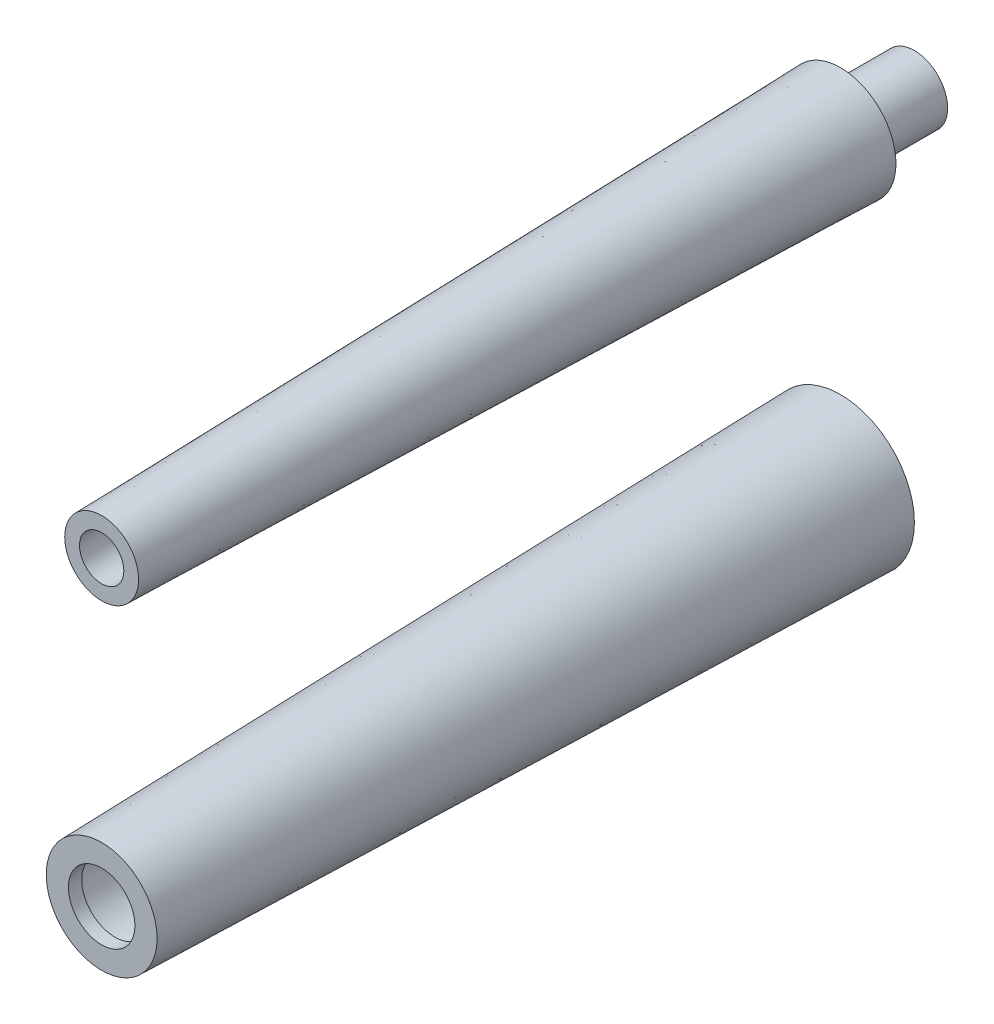
ISO-10303-21;
HEADER;
FILE_DESCRIPTION(('STEP AP214'),'2;1');
FILE_NAME('part.step','',(''),(''),'','','');
FILE_SCHEMA(('AUTOMOTIVE_DESIGN { 1 0 10303 214 1 1 1 1 }'));
ENDSEC;
DATA;
#1=APPLICATION_CONTEXT('core data for automotive mechanical design processes');
#2=APPLICATION_PROTOCOL_DEFINITION('international standard','automotive_design',2000,#1);
#3=PRODUCT_CONTEXT('',#1,'mechanical');
#4=PRODUCT('Part','Part','',(#3));
#5=PRODUCT_RELATED_PRODUCT_CATEGORY('part','',(#4));
#6=PRODUCT_DEFINITION_FORMATION('','',#4);
#7=PRODUCT_DEFINITION_CONTEXT('part definition',#1,'design');
#8=PRODUCT_DEFINITION('design','',#6,#7);
#9=PRODUCT_DEFINITION_SHAPE('','',#8);
#10=(LENGTH_UNIT() NAMED_UNIT(*) SI_UNIT(.MILLI.,.METRE.));
#11=(NAMED_UNIT(*) PLANE_ANGLE_UNIT() SI_UNIT($,.RADIAN.));
#12=(NAMED_UNIT(*) SI_UNIT($,.STERADIAN.) SOLID_ANGLE_UNIT());
#13=UNCERTAINTY_MEASURE_WITH_UNIT(LENGTH_MEASURE(1.E-05),#10,'distance_accuracy_value','');
#14=(GEOMETRIC_REPRESENTATION_CONTEXT(3) GLOBAL_UNCERTAINTY_ASSIGNED_CONTEXT((#13)) GLOBAL_UNIT_ASSIGNED_CONTEXT((#10,
#11,#12)) REPRESENTATION_CONTEXT('',''));
#15=CARTESIAN_POINT('',(0.,0.,0.));
#16=DIRECTION('',(0.,0.,1.));
#17=DIRECTION('',(1.,0.,0.));
#18=AXIS2_PLACEMENT_3D('',#15,#16,#17);
#19=CARTESIAN_POINT('',(0.,15.701730191505,0.));
#20=DIRECTION('',(0.,0.,1.));
#21=DIRECTION('',(1.,0.,0.));
#22=AXIS2_PLACEMENT_3D('',#19,#20,#21);
#23=PLANE('',#22);
#24=CARTESIAN_POINT('',(0.,15.701730191505,0.));
#25=DIRECTION('',(0.,0.,-1.));
#26=DIRECTION('',(-1.,0.,0.));
#27=AXIS2_PLACEMENT_3D('',#24,#25,#26);
#28=CIRCLE('',#27,7.5);
#29=CARTESIAN_POINT('',(-7.5,15.701730191505,0.));
#30=VERTEX_POINT('',#29);
#31=EDGE_CURVE('E47',#30,#30,#28,.T.);
#32=ORIENTED_EDGE('',*,*,#31,.T.);
#33=EDGE_LOOP('',(#32));
#34=FACE_BOUND('',#33,.T.);
#35=CARTESIAN_POINT('',(0.,15.701730191505,0.));
#36=DIRECTION('',(0.,0.,1.));
#37=DIRECTION('',(1.,0.,0.));
#38=AXIS2_PLACEMENT_3D('',#35,#36,#37);
#39=CIRCLE('',#38,4.5);
#40=CARTESIAN_POINT('',(4.5,15.701730191505,0.));
#41=VERTEX_POINT('',#40);
#42=EDGE_CURVE('E11',#41,#41,#39,.F.);
#43=ORIENTED_EDGE('',*,*,#42,.F.);
#44=EDGE_LOOP('',(#43));
#45=FACE_BOUND('',#44,.T.);
#46=ADVANCED_FACE('F41',(#34,#45),#23,.F.);
#47=CARTESIAN_POINT('',(0.,15.701730191505,0.));
#48=DIRECTION('',(0.,0.,-1.));
#49=DIRECTION('',(-1.,0.,0.));
#50=AXIS2_PLACEMENT_3D('',#47,#48,#49);
#51=CONICAL_SURFACE('',#50,7.5,0.0249947936189202);
#52=CARTESIAN_POINT('',(0.,15.701730191505,100.));
#53=DIRECTION('',(0.,0.,-1.));
#54=DIRECTION('',(-1.,0.,0.));
#55=AXIS2_PLACEMENT_3D('',#52,#53,#54);
#56=CIRCLE('',#55,5.);
#57=CARTESIAN_POINT('',(-5.,15.701730191505,100.));
#58=VERTEX_POINT('',#57);
#59=EDGE_CURVE('E51',#58,#58,#56,.T.);
#60=ORIENTED_EDGE('',*,*,#59,.T.);
#61=EDGE_LOOP('',(#60));
#62=FACE_BOUND('',#61,.T.);
#63=ORIENTED_EDGE('',*,*,#31,.F.);
#64=EDGE_LOOP('',(#63));
#65=FACE_BOUND('',#64,.T.);
#66=ADVANCED_FACE('F91',(#62,#65),#51,.T.);
#67=CARTESIAN_POINT('',(0.,15.701730191505,100.));
#68=DIRECTION('',(0.,0.,1.));
#69=DIRECTION('',(1.,0.,0.));
#70=AXIS2_PLACEMENT_3D('',#67,#68,#69);
#71=PLANE('',#70);
#72=CARTESIAN_POINT('',(0.,15.701730191505,100.));
#73=DIRECTION('',(0.,0.,1.));
#74=DIRECTION('',(1.,0.,0.));
#75=AXIS2_PLACEMENT_3D('',#72,#73,#74);
#76=CIRCLE('',#75,2.99937509762574);
#77=CARTESIAN_POINT('',(2.99937509762574,15.701730191505,100.));
#78=VERTEX_POINT('',#77);
#79=EDGE_CURVE('E61',#78,#78,#76,.F.);
#80=ORIENTED_EDGE('',*,*,#79,.T.);
#81=EDGE_LOOP('',(#80));
#82=FACE_BOUND('',#81,.T.);
#83=ORIENTED_EDGE('',*,*,#59,.F.);
#84=EDGE_LOOP('',(#83));
#85=FACE_BOUND('',#84,.T.);
#86=ADVANCED_FACE('F81',(#82,#85),#71,.T.);
#87=CARTESIAN_POINT('',(0.,15.701730191505,2.));
#88=DIRECTION('',(0.,0.,1.));
#89=DIRECTION('',(1.,0.,0.));
#90=AXIS2_PLACEMENT_3D('',#87,#88,#89);
#91=PLANE('',#90);
#92=CARTESIAN_POINT('',(0.,15.701730191505,2.));
#93=DIRECTION('',(0.,0.,1.));
#94=DIRECTION('',(1.,0.,0.));
#95=AXIS2_PLACEMENT_3D('',#92,#93,#94);
#96=CIRCLE('',#95,4.);
#97=CARTESIAN_POINT('',(4.,15.701730191505,2.));
#98=VERTEX_POINT('',#97);
#99=EDGE_CURVE('E59',#98,#98,#96,.T.);
#100=ORIENTED_EDGE('',*,*,#99,.F.);
#101=EDGE_LOOP('',(#100));
#102=FACE_BOUND('',#101,.T.);
#103=CARTESIAN_POINT('',(0.,15.701730191505,2.));
#104=DIRECTION('',(0.,0.,1.));
#105=DIRECTION('',(1.,0.,0.));
#106=AXIS2_PLACEMENT_3D('',#103,#104,#105);
#107=CIRCLE('',#106,5.44937509762574);
#108=CARTESIAN_POINT('',(5.44937509762574,15.701730191505,2.));
#109=VERTEX_POINT('',#108);
#110=EDGE_CURVE('E56',#109,#109,#107,.F.);
#111=ORIENTED_EDGE('',*,*,#110,.F.);
#112=EDGE_LOOP('',(#111));
#113=FACE_BOUND('',#112,.T.);
#114=ADVANCED_FACE('F79',(#102,#113),#91,.T.);
#115=CARTESIAN_POINT('',(0.,15.701730191505,-0.0499843823204061));
#116=DIRECTION('',(0.,0.,-1.));
#117=DIRECTION('',(-1.,0.,0.));
#118=AXIS2_PLACEMENT_3D('',#115,#116,#117);
#119=CONICAL_SURFACE('',#118,5.50062470718375,0.0249947936189202);
#120=ORIENTED_EDGE('',*,*,#79,.F.);
#121=EDGE_LOOP('',(#120));
#122=FACE_BOUND('',#121,.T.);
#123=ORIENTED_EDGE('',*,*,#110,.T.);
#124=EDGE_LOOP('',(#123));
#125=FACE_BOUND('',#124,.T.);
#126=ADVANCED_FACE('F77',(#122,#125),#119,.F.);
#127=CARTESIAN_POINT('',(0.,15.701730191505,5.));
#128=DIRECTION('',(0.,0.,-1.));
#129=DIRECTION('',(-1.,0.,0.));
#130=AXIS2_PLACEMENT_3D('',#127,#128,#129);
#131=CYLINDRICAL_SURFACE('',#130,4.);
#132=ORIENTED_EDGE('',*,*,#99,.T.);
#133=EDGE_LOOP('',(#132));
#134=FACE_BOUND('',#133,.T.);
#135=CARTESIAN_POINT('',(0.,15.701730191505,-10.));
#136=DIRECTION('',(0.,0.,-1.));
#137=DIRECTION('',(-1.,0.,0.));
#138=AXIS2_PLACEMENT_3D('',#135,#136,#137);
#139=CIRCLE('',#138,4.);
#140=CARTESIAN_POINT('',(-4.,15.701730191505,-10.));
#141=VERTEX_POINT('',#140);
#142=EDGE_CURVE('E67',#141,#141,#139,.T.);
#143=ORIENTED_EDGE('',*,*,#142,.T.);
#144=EDGE_LOOP('',(#143));
#145=FACE_BOUND('',#144,.T.);
#146=ADVANCED_FACE('F88',(#134,#145),#131,.F.);
#147=CARTESIAN_POINT('',(0.,15.701730191505,-10.));
#148=DIRECTION('',(0.,0.,-1.));
#149=DIRECTION('',(-1.,0.,0.));
#150=AXIS2_PLACEMENT_3D('',#147,#148,#149);
#151=PLANE('',#150);
#152=CARTESIAN_POINT('',(0.,15.701730191505,-10.));
#153=DIRECTION('',(0.,0.,-1.));
#154=DIRECTION('',(-1.,0.,0.));
#155=AXIS2_PLACEMENT_3D('',#152,#153,#154);
#156=CIRCLE('',#155,4.5);
#157=CARTESIAN_POINT('',(-4.5,15.701730191505,-10.));
#158=VERTEX_POINT('',#157);
#159=EDGE_CURVE('E62',#158,#158,#156,.T.);
#160=ORIENTED_EDGE('',*,*,#159,.T.);
#161=EDGE_LOOP('',(#160));
#162=FACE_BOUND('',#161,.T.);
#163=ORIENTED_EDGE('',*,*,#142,.F.);
#164=EDGE_LOOP('',(#163));
#165=FACE_BOUND('',#164,.T.);
#166=ADVANCED_FACE('F146',(#162,#165),#151,.T.);
#167=CARTESIAN_POINT('',(0.,15.701730191505,-10.));
#168=DIRECTION('',(0.,0.,1.));
#169=DIRECTION('',(1.,0.,0.));
#170=AXIS2_PLACEMENT_3D('',#167,#168,#169);
#171=CYLINDRICAL_SURFACE('',#170,4.5);
#172=ORIENTED_EDGE('',*,*,#159,.F.);
#173=EDGE_LOOP('',(#172));
#174=FACE_BOUND('',#173,.T.);
#175=ORIENTED_EDGE('',*,*,#42,.T.);
#176=EDGE_LOOP('',(#175));
#177=FACE_BOUND('',#176,.T.);
#178=ADVANCED_FACE('F154',(#174,#177),#171,.T.);
#179=CLOSED_SHELL('',(#46,#66,#86,#114,#126,#146,#166,#178));
#180=MANIFOLD_SOLID_BREP('B2',#179);
#181=CARTESIAN_POINT('',(0.,-25.1228422702399,0.));
#182=DIRECTION('',(0.,0.,1.));
#183=DIRECTION('',(1.,0.,0.));
#184=AXIS2_PLACEMENT_3D('',#181,#182,#183);
#185=PLANE('',#184);
#186=CARTESIAN_POINT('',(0.,-25.1228422702399,0.));
#187=DIRECTION('',(0.,0.,1.));
#188=DIRECTION('',(1.,0.,0.));
#189=AXIS2_PLACEMENT_3D('',#186,#187,#188);
#190=CIRCLE('',#189,8.19943758786317);
#191=CARTESIAN_POINT('',(8.19943758786317,-25.1228422702399,0.));
#192=VERTEX_POINT('',#191);
#193=EDGE_CURVE('E189',#192,#192,#190,.T.);
#194=ORIENTED_EDGE('',*,*,#193,.T.);
#195=EDGE_LOOP('',(#194));
#196=FACE_BOUND('',#195,.T.);
#197=CARTESIAN_POINT('',(0.,-25.1228422702399,0.));
#198=DIRECTION('',(0.,0.,1.));
#199=DIRECTION('',(1.,0.,0.));
#200=AXIS2_PLACEMENT_3D('',#197,#198,#199);
#201=CIRCLE('',#200,10.);
#202=CARTESIAN_POINT('',(10.,-25.1228422702399,0.));
#203=VERTEX_POINT('',#202);
#204=EDGE_CURVE('E40',#203,#203,#201,.T.);
#205=ORIENTED_EDGE('',*,*,#204,.F.);
#206=EDGE_LOOP('',(#205));
#207=FACE_BOUND('',#206,.T.);
#208=ADVANCED_FACE('F178',(#196,#207),#185,.F.);
#209=CARTESIAN_POINT('',(0.,-25.1228422702399,100.));
#210=DIRECTION('',(0.,0.,-1.));
#211=DIRECTION('',(-1.,0.,0.));
#212=AXIS2_PLACEMENT_3D('',#209,#210,#211);
#213=CONICAL_SURFACE('',#212,7.5,0.0249947936189201);
#214=ORIENTED_EDGE('',*,*,#204,.T.);
#215=EDGE_LOOP('',(#214));
#216=FACE_BOUND('',#215,.T.);
#217=CARTESIAN_POINT('',(0.,-25.1228422702399,100.));
#218=DIRECTION('',(0.,0.,1.));
#219=DIRECTION('',(1.,0.,0.));
#220=AXIS2_PLACEMENT_3D('',#217,#218,#219);
#221=CIRCLE('',#220,7.5);
#222=CARTESIAN_POINT('',(7.5,-25.1228422702399,100.));
#223=VERTEX_POINT('',#222);
#224=EDGE_CURVE('E185',#223,#223,#221,.T.);
#225=ORIENTED_EDGE('',*,*,#224,.F.);
#226=EDGE_LOOP('',(#225));
#227=FACE_BOUND('',#226,.T.);
#228=ADVANCED_FACE('F217',(#216,#227),#213,.T.);
#229=CARTESIAN_POINT('',(0.,-25.1228422702399,100.));
#230=DIRECTION('',(0.,0.,1.));
#231=DIRECTION('',(1.,0.,0.));
#232=AXIS2_PLACEMENT_3D('',#229,#230,#231);
#233=PLANE('',#232);
#234=CARTESIAN_POINT('',(0.,-25.1228422702399,100.));
#235=DIRECTION('',(0.,0.,1.));
#236=DIRECTION('',(1.,0.,0.));
#237=AXIS2_PLACEMENT_3D('',#234,#235,#236);
#238=CIRCLE('',#237,4.5);
#239=CARTESIAN_POINT('',(4.5,-25.1228422702399,100.));
#240=VERTEX_POINT('',#239);
#241=EDGE_CURVE('E197',#240,#240,#238,.T.);
#242=ORIENTED_EDGE('',*,*,#241,.F.);
#243=EDGE_LOOP('',(#242));
#244=FACE_BOUND('',#243,.T.);
#245=ORIENTED_EDGE('',*,*,#224,.T.);
#246=EDGE_LOOP('',(#245));
#247=FACE_BOUND('',#246,.T.);
#248=ADVANCED_FACE('F222',(#244,#247),#233,.T.);
#249=CARTESIAN_POINT('',(0.,-25.1228422702399,99.9550140559116));
#250=DIRECTION('',(0.,0.,-1.));
#251=DIRECTION('',(-1.,0.,0.));
#252=AXIS2_PLACEMENT_3D('',#249,#250,#251);
#253=CONICAL_SURFACE('',#252,5.70056223646538,0.0249947936189201);
#254=ORIENTED_EDGE('',*,*,#193,.F.);
#255=EDGE_LOOP('',(#254));
#256=FACE_BOUND('',#255,.T.);
#257=CARTESIAN_POINT('',(0.,-25.1228422702399,98.2));
#258=DIRECTION('',(0.,0.,1.));
#259=DIRECTION('',(1.,0.,0.));
#260=AXIS2_PLACEMENT_3D('',#257,#258,#259);
#261=CIRCLE('',#260,5.74443758786317);
#262=CARTESIAN_POINT('',(5.74443758786317,-25.1228422702399,98.2));
#263=VERTEX_POINT('',#262);
#264=EDGE_CURVE('E194',#263,#263,#261,.T.);
#265=ORIENTED_EDGE('',*,*,#264,.T.);
#266=EDGE_LOOP('',(#265));
#267=FACE_BOUND('',#266,.T.);
#268=ADVANCED_FACE('F213',(#256,#267),#253,.F.);
#269=CARTESIAN_POINT('',(0.,-25.1228422702399,98.2));
#270=DIRECTION('',(0.,0.,1.));
#271=DIRECTION('',(1.,0.,0.));
#272=AXIS2_PLACEMENT_3D('',#269,#270,#271);
#273=PLANE('',#272);
#274=CARTESIAN_POINT('',(0.,-25.1228422702399,98.2));
#275=DIRECTION('',(0.,0.,1.));
#276=DIRECTION('',(1.,0.,0.));
#277=AXIS2_PLACEMENT_3D('',#274,#275,#276);
#278=CIRCLE('',#277,4.5);
#279=CARTESIAN_POINT('',(4.5,-25.1228422702399,98.2));
#280=VERTEX_POINT('',#279);
#281=EDGE_CURVE('E181',#280,#280,#278,.T.);
#282=ORIENTED_EDGE('',*,*,#281,.T.);
#283=EDGE_LOOP('',(#282));
#284=FACE_BOUND('',#283,.T.);
#285=ORIENTED_EDGE('',*,*,#264,.F.);
#286=EDGE_LOOP('',(#285));
#287=FACE_BOUND('',#286,.T.);
#288=ADVANCED_FACE('F204',(#284,#287),#273,.F.);
#289=CARTESIAN_POINT('',(0.,-25.1228422702399,90.));
#290=DIRECTION('',(0.,0.,1.));
#291=DIRECTION('',(1.,0.,0.));
#292=AXIS2_PLACEMENT_3D('',#289,#290,#291);
#293=CYLINDRICAL_SURFACE('',#292,4.5);
#294=ORIENTED_EDGE('',*,*,#241,.T.);
#295=EDGE_LOOP('',(#294));
#296=FACE_BOUND('',#295,.T.);
#297=ORIENTED_EDGE('',*,*,#281,.F.);
#298=EDGE_LOOP('',(#297));
#299=FACE_BOUND('',#298,.T.);
#300=ADVANCED_FACE('F207',(#296,#299),#293,.F.);
#301=CLOSED_SHELL('',(#208,#228,#248,#268,#288,#300));
#302=MANIFOLD_SOLID_BREP('B6',#301);
#303=ADVANCED_BREP_SHAPE_REPRESENTATION('',(#18,#180,#302),#14);
#304=SHAPE_DEFINITION_REPRESENTATION(#9,#303);
ENDSEC;
END-ISO-10303-21;
